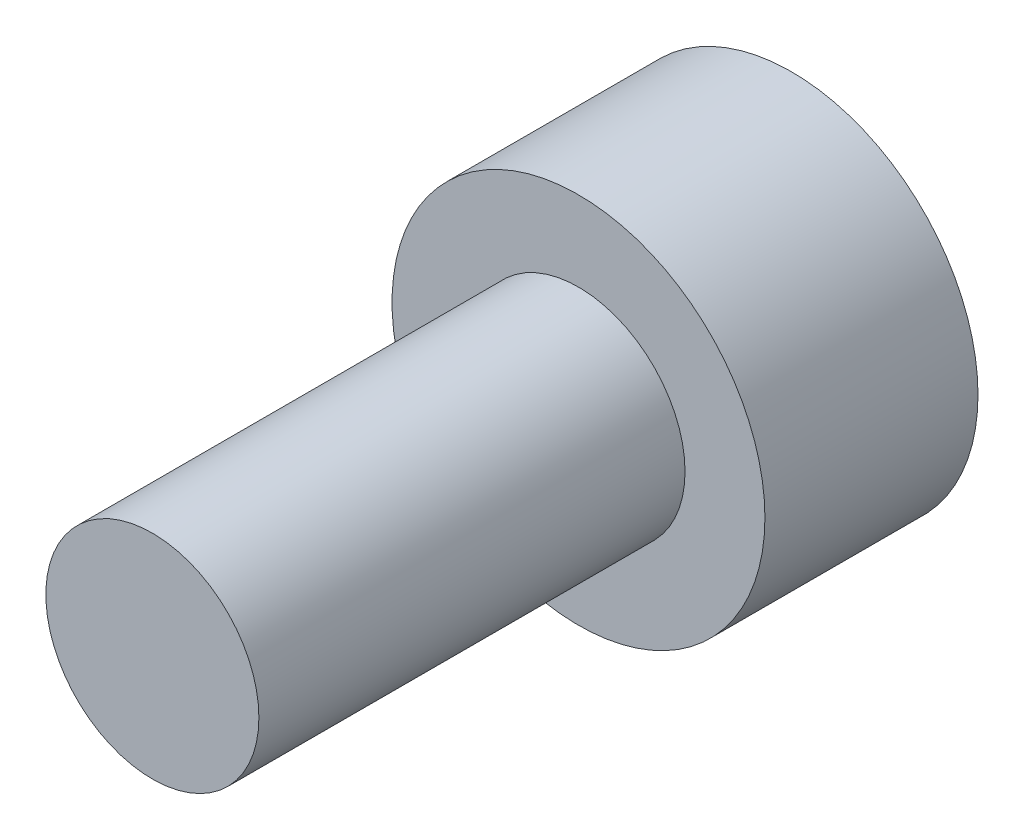
ISO-10303-21;
HEADER;
FILE_DESCRIPTION(('STEP AP214'),'2;1');
FILE_NAME('part.step','',(''),(''),'','','');
FILE_SCHEMA(('AUTOMOTIVE_DESIGN { 1 0 10303 214 1 1 1 1 }'));
ENDSEC;
DATA;
#1=APPLICATION_CONTEXT('core data for automotive mechanical design processes');
#2=APPLICATION_PROTOCOL_DEFINITION('international standard','automotive_design',2000,#1);
#3=PRODUCT_CONTEXT('',#1,'mechanical');
#4=PRODUCT('Part','Part','',(#3));
#5=PRODUCT_RELATED_PRODUCT_CATEGORY('part','',(#4));
#6=PRODUCT_DEFINITION_FORMATION('','',#4);
#7=PRODUCT_DEFINITION_CONTEXT('part definition',#1,'design');
#8=PRODUCT_DEFINITION('design','',#6,#7);
#9=PRODUCT_DEFINITION_SHAPE('','',#8);
#10=(LENGTH_UNIT() NAMED_UNIT(*) SI_UNIT(.MILLI.,.METRE.));
#11=(NAMED_UNIT(*) PLANE_ANGLE_UNIT() SI_UNIT($,.RADIAN.));
#12=(NAMED_UNIT(*) SI_UNIT($,.STERADIAN.) SOLID_ANGLE_UNIT());
#13=UNCERTAINTY_MEASURE_WITH_UNIT(LENGTH_MEASURE(1.E-05),#10,'distance_accuracy_value','');
#14=(GEOMETRIC_REPRESENTATION_CONTEXT(3) GLOBAL_UNCERTAINTY_ASSIGNED_CONTEXT((#13)) GLOBAL_UNIT_ASSIGNED_CONTEXT((#10,
#11,#12)) REPRESENTATION_CONTEXT('',''));
#15=CARTESIAN_POINT('',(0.,0.,0.));
#16=DIRECTION('',(0.,0.,1.));
#17=DIRECTION('',(1.,0.,0.));
#18=AXIS2_PLACEMENT_3D('',#15,#16,#17);
#19=CARTESIAN_POINT('',(0.,0.,8.));
#20=DIRECTION('',(0.,0.,-1.));
#21=DIRECTION('',(-1.,0.,0.));
#22=AXIS2_PLACEMENT_3D('',#19,#20,#21);
#23=CYLINDRICAL_SURFACE('',#22,2.);
#24=CARTESIAN_POINT('',(0.,0.,8.));
#25=DIRECTION('',(0.,0.,1.));
#26=DIRECTION('',(1.,0.,0.));
#27=AXIS2_PLACEMENT_3D('',#24,#25,#26);
#28=CIRCLE('',#27,2.);
#29=CARTESIAN_POINT('',(2.,0.,8.));
#30=VERTEX_POINT('',#29);
#31=EDGE_CURVE('E10',#30,#30,#28,.T.);
#32=ORIENTED_EDGE('',*,*,#31,.F.);
#33=EDGE_LOOP('',(#32));
#34=FACE_BOUND('',#33,.T.);
#35=CARTESIAN_POINT('',(0.,0.,0.));
#36=DIRECTION('',(0.,0.,1.));
#37=DIRECTION('',(1.,0.,0.));
#38=AXIS2_PLACEMENT_3D('',#35,#36,#37);
#39=CIRCLE('',#38,2.);
#40=CARTESIAN_POINT('',(2.,0.,0.));
#41=VERTEX_POINT('',#40);
#42=EDGE_CURVE('E44',#41,#41,#39,.T.);
#43=ORIENTED_EDGE('',*,*,#42,.T.);
#44=EDGE_LOOP('',(#43));
#45=FACE_BOUND('',#44,.T.);
#46=ADVANCED_FACE('F41',(#34,#45),#23,.T.);
#47=CARTESIAN_POINT('',(0.,0.,8.));
#48=DIRECTION('',(0.,0.,1.));
#49=DIRECTION('',(1.,0.,0.));
#50=AXIS2_PLACEMENT_3D('',#47,#48,#49);
#51=PLANE('',#50);
#52=ORIENTED_EDGE('',*,*,#31,.T.);
#53=EDGE_LOOP('',(#52));
#54=FACE_BOUND('',#53,.T.);
#55=ADVANCED_FACE('F76',(#54),#51,.T.);
#56=CARTESIAN_POINT('',(0.,0.,-4.));
#57=DIRECTION('',(0.,0.,1.));
#58=DIRECTION('',(1.,0.,0.));
#59=AXIS2_PLACEMENT_3D('',#56,#57,#58);
#60=CYLINDRICAL_SURFACE('',#59,3.5);
#61=CARTESIAN_POINT('',(0.,0.,-4.));
#62=DIRECTION('',(0.,0.,1.));
#63=DIRECTION('',(1.,0.,0.));
#64=AXIS2_PLACEMENT_3D('',#61,#62,#63);
#65=CIRCLE('',#64,3.5);
#66=CARTESIAN_POINT('',(3.5,0.,-4.));
#67=VERTEX_POINT('',#66);
#68=EDGE_CURVE('E53',#67,#67,#65,.T.);
#69=ORIENTED_EDGE('',*,*,#68,.T.);
#70=EDGE_LOOP('',(#69));
#71=FACE_BOUND('',#70,.T.);
#72=CARTESIAN_POINT('',(0.,0.,0.));
#73=DIRECTION('',(0.,0.,1.));
#74=DIRECTION('',(1.,0.,0.));
#75=AXIS2_PLACEMENT_3D('',#72,#73,#74);
#76=CIRCLE('',#75,3.5);
#77=CARTESIAN_POINT('',(3.5,0.,0.));
#78=VERTEX_POINT('',#77);
#79=EDGE_CURVE('E55',#78,#78,#76,.T.);
#80=ORIENTED_EDGE('',*,*,#79,.F.);
#81=EDGE_LOOP('',(#80));
#82=FACE_BOUND('',#81,.T.);
#83=ADVANCED_FACE('F63',(#71,#82),#60,.T.);
#84=CARTESIAN_POINT('',(0.,0.,-4.));
#85=DIRECTION('',(0.,0.,1.));
#86=DIRECTION('',(1.,0.,0.));
#87=AXIS2_PLACEMENT_3D('',#84,#85,#86);
#88=PLANE('',#87);
#89=ORIENTED_EDGE('',*,*,#68,.F.);
#90=EDGE_LOOP('',(#89));
#91=FACE_BOUND('',#90,.T.);
#92=ADVANCED_FACE('F66',(#91),#88,.F.);
#93=CARTESIAN_POINT('',(0.,0.,0.));
#94=DIRECTION('',(0.,0.,1.));
#95=DIRECTION('',(1.,0.,0.));
#96=AXIS2_PLACEMENT_3D('',#93,#94,#95);
#97=PLANE('',#96);
#98=ORIENTED_EDGE('',*,*,#42,.F.);
#99=EDGE_LOOP('',(#98));
#100=FACE_BOUND('',#99,.T.);
#101=ORIENTED_EDGE('',*,*,#79,.T.);
#102=EDGE_LOOP('',(#101));
#103=FACE_BOUND('',#102,.T.);
#104=ADVANCED_FACE('F68',(#100,#103),#97,.T.);
#105=CLOSED_SHELL('',(#46,#55,#83,#92,#104));
#106=MANIFOLD_SOLID_BREP('B2',#105);
#107=ADVANCED_BREP_SHAPE_REPRESENTATION('',(#18,#106),#14);
#108=SHAPE_DEFINITION_REPRESENTATION(#9,#107);
ENDSEC;
END-ISO-10303-21;
